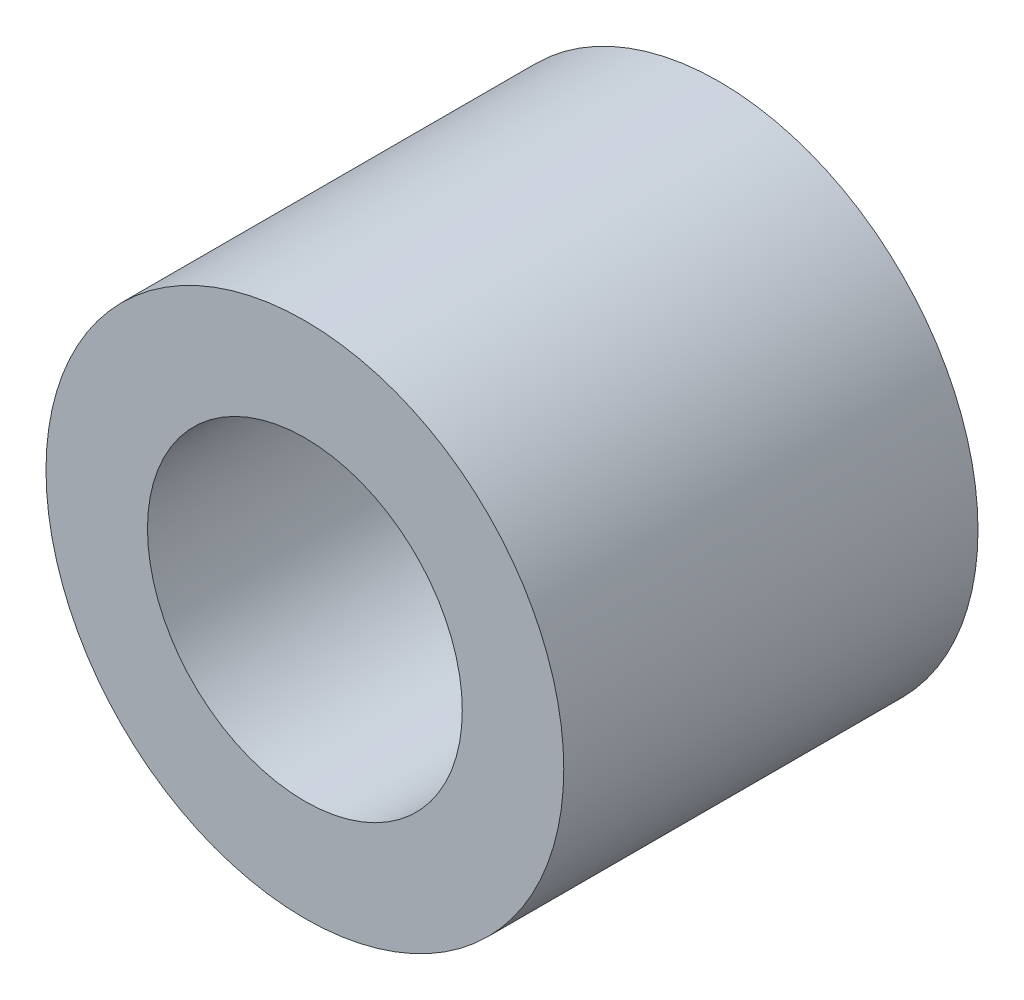
ISO-10303-21;
HEADER;
FILE_DESCRIPTION(('STEP AP214'),'2;1');
FILE_NAME('part.step','',(''),(''),'','','');
FILE_SCHEMA(('AUTOMOTIVE_DESIGN { 1 0 10303 214 1 1 1 1 }'));
ENDSEC;
DATA;
#1=APPLICATION_CONTEXT('core data for automotive mechanical design processes');
#2=APPLICATION_PROTOCOL_DEFINITION('international standard','automotive_design',2000,#1);
#3=PRODUCT_CONTEXT('',#1,'mechanical');
#4=PRODUCT('Part','Part','',(#3));
#5=PRODUCT_RELATED_PRODUCT_CATEGORY('part','',(#4));
#6=PRODUCT_DEFINITION_FORMATION('','',#4);
#7=PRODUCT_DEFINITION_CONTEXT('part definition',#1,'design');
#8=PRODUCT_DEFINITION('design','',#6,#7);
#9=PRODUCT_DEFINITION_SHAPE('','',#8);
#10=(LENGTH_UNIT() NAMED_UNIT(*) SI_UNIT(.MILLI.,.METRE.));
#11=(NAMED_UNIT(*) PLANE_ANGLE_UNIT() SI_UNIT($,.RADIAN.));
#12=(NAMED_UNIT(*) SI_UNIT($,.STERADIAN.) SOLID_ANGLE_UNIT());
#13=UNCERTAINTY_MEASURE_WITH_UNIT(LENGTH_MEASURE(1.E-05),#10,'distance_accuracy_value','');
#14=(GEOMETRIC_REPRESENTATION_CONTEXT(3) GLOBAL_UNCERTAINTY_ASSIGNED_CONTEXT((#13)) GLOBAL_UNIT_ASSIGNED_CONTEXT((#10,
#11,#12)) REPRESENTATION_CONTEXT('',''));
#15=CARTESIAN_POINT('',(0.,0.,0.));
#16=DIRECTION('',(0.,0.,1.));
#17=DIRECTION('',(1.,0.,0.));
#18=AXIS2_PLACEMENT_3D('',#15,#16,#17);
#19=CARTESIAN_POINT('',(0.,0.,-152.4));
#20=DIRECTION('',(0.,0.,1.));
#21=DIRECTION('',(1.,0.,0.));
#22=AXIS2_PLACEMENT_3D('',#19,#20,#21);
#23=CYLINDRICAL_SURFACE('',#22,7.9375);
#24=CARTESIAN_POINT('',(0.,0.,-152.4));
#25=DIRECTION('',(0.,0.,1.));
#26=DIRECTION('',(1.,0.,0.));
#27=AXIS2_PLACEMENT_3D('',#24,#25,#26);
#28=CIRCLE('',#27,7.9375);
#29=CARTESIAN_POINT('',(7.9375,0.,-152.4));
#30=VERTEX_POINT('',#29);
#31=EDGE_CURVE('E10',#30,#30,#28,.T.);
#32=CARTESIAN_POINT('',(0.,0.,-139.7));
#33=DIRECTION('',(0.,0.,1.));
#34=DIRECTION('',(1.,0.,0.));
#35=AXIS2_PLACEMENT_3D('',#32,#33,#34);
#36=CIRCLE('',#35,7.9375);
#37=CARTESIAN_POINT('',(7.9375,0.,-139.7));
#38=VERTEX_POINT('',#37);
#39=EDGE_CURVE('E45',#38,#38,#36,.T.);
#40=CARTESIAN_POINT('',(7.9375,0.,-152.4));
#41=CARTESIAN_POINT('',(7.9375,0.,-152.267708333333));
#42=CARTESIAN_POINT('',(7.9375,0.,-152.135416666667));
#43=CARTESIAN_POINT('',(7.9375,0.,-151.870833333333));
#44=CARTESIAN_POINT('',(7.9375,0.,-151.738541666667));
#45=CARTESIAN_POINT('',(7.9375,0.,-151.473958333333));
#46=CARTESIAN_POINT('',(7.9375,0.,-151.341666666667));
#47=CARTESIAN_POINT('',(7.9375,0.,-151.077083333333));
#48=CARTESIAN_POINT('',(7.9375,0.,-150.944791666667));
#49=CARTESIAN_POINT('',(7.9375,0.,-150.680208333333));
#50=CARTESIAN_POINT('',(7.9375,0.,-150.547916666667));
#51=CARTESIAN_POINT('',(7.9375,0.,-150.283333333333));
#52=CARTESIAN_POINT('',(7.9375,0.,-150.151041666667));
#53=CARTESIAN_POINT('',(7.9375,0.,-149.886458333333));
#54=CARTESIAN_POINT('',(7.9375,0.,-149.754166666667));
#55=CARTESIAN_POINT('',(7.9375,0.,-149.489583333333));
#56=CARTESIAN_POINT('',(7.9375,0.,-149.357291666667));
#57=CARTESIAN_POINT('',(7.9375,0.,-149.092708333333));
#58=CARTESIAN_POINT('',(7.9375,0.,-148.960416666667));
#59=CARTESIAN_POINT('',(7.9375,0.,-148.695833333333));
#60=CARTESIAN_POINT('',(7.9375,0.,-148.563541666667));
#61=CARTESIAN_POINT('',(7.9375,0.,-148.298958333333));
#62=CARTESIAN_POINT('',(7.9375,0.,-148.166666666667));
#63=CARTESIAN_POINT('',(7.9375,0.,-147.902083333333));
#64=CARTESIAN_POINT('',(7.9375,0.,-147.769791666667));
#65=CARTESIAN_POINT('',(7.9375,0.,-147.505208333333));
#66=CARTESIAN_POINT('',(7.9375,0.,-147.372916666667));
#67=CARTESIAN_POINT('',(7.9375,0.,-147.108333333333));
#68=CARTESIAN_POINT('',(7.9375,0.,-146.976041666667));
#69=CARTESIAN_POINT('',(7.9375,0.,-146.711458333333));
#70=CARTESIAN_POINT('',(7.9375,0.,-146.579166666667));
#71=CARTESIAN_POINT('',(7.9375,0.,-146.314583333333));
#72=CARTESIAN_POINT('',(7.9375,0.,-146.182291666667));
#73=CARTESIAN_POINT('',(7.9375,0.,-145.917708333333));
#74=CARTESIAN_POINT('',(7.9375,0.,-145.785416666667));
#75=CARTESIAN_POINT('',(7.9375,0.,-145.520833333333));
#76=CARTESIAN_POINT('',(7.9375,0.,-145.388541666667));
#77=CARTESIAN_POINT('',(7.9375,0.,-145.123958333333));
#78=CARTESIAN_POINT('',(7.9375,0.,-144.991666666667));
#79=CARTESIAN_POINT('',(7.9375,0.,-144.727083333333));
#80=CARTESIAN_POINT('',(7.9375,0.,-144.594791666667));
#81=CARTESIAN_POINT('',(7.9375,0.,-144.330208333333));
#82=CARTESIAN_POINT('',(7.9375,0.,-144.197916666667));
#83=CARTESIAN_POINT('',(7.9375,0.,-143.933333333333));
#84=CARTESIAN_POINT('',(7.9375,0.,-143.801041666667));
#85=CARTESIAN_POINT('',(7.9375,0.,-143.536458333333));
#86=CARTESIAN_POINT('',(7.9375,0.,-143.404166666667));
#87=CARTESIAN_POINT('',(7.9375,0.,-143.139583333333));
#88=CARTESIAN_POINT('',(7.9375,0.,-143.007291666667));
#89=CARTESIAN_POINT('',(7.9375,0.,-142.742708333333));
#90=CARTESIAN_POINT('',(7.9375,0.,-142.610416666667));
#91=CARTESIAN_POINT('',(7.9375,0.,-142.345833333333));
#92=CARTESIAN_POINT('',(7.9375,0.,-142.213541666667));
#93=CARTESIAN_POINT('',(7.9375,0.,-141.948958333333));
#94=CARTESIAN_POINT('',(7.9375,0.,-141.816666666667));
#95=CARTESIAN_POINT('',(7.9375,0.,-141.552083333333));
#96=CARTESIAN_POINT('',(7.9375,0.,-141.419791666667));
#97=CARTESIAN_POINT('',(7.9375,0.,-141.155208333333));
#98=CARTESIAN_POINT('',(7.9375,0.,-141.022916666667));
#99=CARTESIAN_POINT('',(7.9375,0.,-140.758333333333));
#100=CARTESIAN_POINT('',(7.9375,0.,-140.626041666667));
#101=CARTESIAN_POINT('',(7.9375,0.,-140.361458333333));
#102=CARTESIAN_POINT('',(7.9375,0.,-140.229166666667));
#103=CARTESIAN_POINT('',(7.9375,0.,-139.964583333333));
#104=CARTESIAN_POINT('',(7.9375,0.,-139.832291666667));
#105=CARTESIAN_POINT('',(7.9375,0.,-139.7));
#106=B_SPLINE_CURVE_WITH_KNOTS('',3,(#40,#41,#42,#43,#44,#45,#46,#47,#48,#49,#50,#51,#52,#53,
#54,#55,#56,#57,#58,#59,#60,#61,#62,#63,#64,#65,#66,#67,#68,#69,#70,#71,#72,#73,#74,#75,#76,#77,
#78,#79,#80,#81,#82,#83,#84,#85,#86,#87,#88,#89,#90,#91,#92,#93,#94,#95,#96,#97,#98,#99,#100,
#101,#102,#103,#104,#105),.UNSPECIFIED.,.F.,.F.,(4,2,2,2,2,2,2,2,2,2,2,2,2,2,2,2,2,2,2,2,2,2,2,
2,2,2,2,2,2,2,2,2,4),(0.,0.396875000000019,0.79375000000001,1.19062500000003,1.58750000000002,
1.98437500000001,2.38125000000003,2.77812500000002,3.17500000000004,3.57187500000003,
3.96875000000002,4.36562500000004,4.76250000000003,5.15937500000002,5.55625000000004,
5.95312500000003,6.35000000000005,6.74687500000004,7.14375000000003,7.54062500000005,
7.93750000000004,8.33437500000003,8.73125000000005,9.12812500000004,9.52500000000006,
9.92187500000005,10.31875,10.7156250000001,11.1125000000001,11.509375,11.9062500000001,
12.3031250000001,12.7000000000001),.UNSPECIFIED.);
#107=EDGE_CURVE('BSEAM32',#30,#38,#106,.T.);
#108=ORIENTED_EDGE('',*,*,#31,.T.);
#109=ORIENTED_EDGE('',*,*,#39,.F.);
#110=ORIENTED_EDGE('',*,*,#107,.T.);
#111=ORIENTED_EDGE('',*,*,#107,.F.);
#112=EDGE_LOOP('',(#108,#110,#109,#111));
#113=FACE_BOUND('',#112,.T.);
#114=ADVANCED_FACE('F32',(#113),#23,.T.);
#115=CARTESIAN_POINT('',(0.,0.,-152.4));
#116=DIRECTION('',(0.,0.,1.));
#117=DIRECTION('',(1.,0.,0.));
#118=AXIS2_PLACEMENT_3D('',#115,#116,#117);
#119=CYLINDRICAL_SURFACE('',#118,4.826);
#120=CARTESIAN_POINT('',(0.,0.,-152.4));
#121=DIRECTION('',(0.,0.,1.));
#122=DIRECTION('',(1.,0.,0.));
#123=AXIS2_PLACEMENT_3D('',#120,#121,#122);
#124=CIRCLE('',#123,4.826);
#125=CARTESIAN_POINT('',(4.826,0.,-152.4));
#126=VERTEX_POINT('',#125);
#127=EDGE_CURVE('E39',#126,#126,#124,.T.);
#128=CARTESIAN_POINT('',(0.,0.,-139.7));
#129=DIRECTION('',(0.,0.,1.));
#130=DIRECTION('',(1.,0.,0.));
#131=AXIS2_PLACEMENT_3D('',#128,#129,#130);
#132=CIRCLE('',#131,4.826);
#133=CARTESIAN_POINT('',(4.826,0.,-139.7));
#134=VERTEX_POINT('',#133);
#135=EDGE_CURVE('E35',#134,#134,#132,.F.);
#136=CARTESIAN_POINT('',(4.826,0.,-152.4));
#137=CARTESIAN_POINT('',(4.826,0.,-152.267708333333));
#138=CARTESIAN_POINT('',(4.826,0.,-152.135416666667));
#139=CARTESIAN_POINT('',(4.826,0.,-151.870833333333));
#140=CARTESIAN_POINT('',(4.826,0.,-151.738541666667));
#141=CARTESIAN_POINT('',(4.826,0.,-151.473958333333));
#142=CARTESIAN_POINT('',(4.826,0.,-151.341666666667));
#143=CARTESIAN_POINT('',(4.826,0.,-151.077083333333));
#144=CARTESIAN_POINT('',(4.826,0.,-150.944791666667));
#145=CARTESIAN_POINT('',(4.826,0.,-150.680208333333));
#146=CARTESIAN_POINT('',(4.826,0.,-150.547916666667));
#147=CARTESIAN_POINT('',(4.826,0.,-150.283333333333));
#148=CARTESIAN_POINT('',(4.826,0.,-150.151041666667));
#149=CARTESIAN_POINT('',(4.826,0.,-149.886458333333));
#150=CARTESIAN_POINT('',(4.826,0.,-149.754166666667));
#151=CARTESIAN_POINT('',(4.826,0.,-149.489583333333));
#152=CARTESIAN_POINT('',(4.826,0.,-149.357291666667));
#153=CARTESIAN_POINT('',(4.826,0.,-149.092708333333));
#154=CARTESIAN_POINT('',(4.826,0.,-148.960416666667));
#155=CARTESIAN_POINT('',(4.826,0.,-148.695833333333));
#156=CARTESIAN_POINT('',(4.826,0.,-148.563541666667));
#157=CARTESIAN_POINT('',(4.826,0.,-148.298958333333));
#158=CARTESIAN_POINT('',(4.826,0.,-148.166666666667));
#159=CARTESIAN_POINT('',(4.826,0.,-147.902083333333));
#160=CARTESIAN_POINT('',(4.826,0.,-147.769791666667));
#161=CARTESIAN_POINT('',(4.826,0.,-147.505208333333));
#162=CARTESIAN_POINT('',(4.826,0.,-147.372916666667));
#163=CARTESIAN_POINT('',(4.826,0.,-147.108333333333));
#164=CARTESIAN_POINT('',(4.826,0.,-146.976041666667));
#165=CARTESIAN_POINT('',(4.826,0.,-146.711458333333));
#166=CARTESIAN_POINT('',(4.826,0.,-146.579166666667));
#167=CARTESIAN_POINT('',(4.826,0.,-146.314583333333));
#168=CARTESIAN_POINT('',(4.826,0.,-146.182291666667));
#169=CARTESIAN_POINT('',(4.826,0.,-145.917708333333));
#170=CARTESIAN_POINT('',(4.826,0.,-145.785416666667));
#171=CARTESIAN_POINT('',(4.826,0.,-145.520833333333));
#172=CARTESIAN_POINT('',(4.826,0.,-145.388541666667));
#173=CARTESIAN_POINT('',(4.826,0.,-145.123958333333));
#174=CARTESIAN_POINT('',(4.826,0.,-144.991666666667));
#175=CARTESIAN_POINT('',(4.826,0.,-144.727083333333));
#176=CARTESIAN_POINT('',(4.826,0.,-144.594791666667));
#177=CARTESIAN_POINT('',(4.826,0.,-144.330208333333));
#178=CARTESIAN_POINT('',(4.826,0.,-144.197916666667));
#179=CARTESIAN_POINT('',(4.826,0.,-143.933333333333));
#180=CARTESIAN_POINT('',(4.826,0.,-143.801041666667));
#181=CARTESIAN_POINT('',(4.826,0.,-143.536458333333));
#182=CARTESIAN_POINT('',(4.826,0.,-143.404166666667));
#183=CARTESIAN_POINT('',(4.826,0.,-143.139583333333));
#184=CARTESIAN_POINT('',(4.826,0.,-143.007291666667));
#185=CARTESIAN_POINT('',(4.826,0.,-142.742708333333));
#186=CARTESIAN_POINT('',(4.826,0.,-142.610416666667));
#187=CARTESIAN_POINT('',(4.826,0.,-142.345833333333));
#188=CARTESIAN_POINT('',(4.826,0.,-142.213541666667));
#189=CARTESIAN_POINT('',(4.826,0.,-141.948958333333));
#190=CARTESIAN_POINT('',(4.826,0.,-141.816666666667));
#191=CARTESIAN_POINT('',(4.826,0.,-141.552083333333));
#192=CARTESIAN_POINT('',(4.826,0.,-141.419791666667));
#193=CARTESIAN_POINT('',(4.826,0.,-141.155208333333));
#194=CARTESIAN_POINT('',(4.826,0.,-141.022916666667));
#195=CARTESIAN_POINT('',(4.826,0.,-140.758333333333));
#196=CARTESIAN_POINT('',(4.826,0.,-140.626041666667));
#197=CARTESIAN_POINT('',(4.826,0.,-140.361458333333));
#198=CARTESIAN_POINT('',(4.826,0.,-140.229166666667));
#199=CARTESIAN_POINT('',(4.826,0.,-139.964583333333));
#200=CARTESIAN_POINT('',(4.826,0.,-139.832291666667));
#201=CARTESIAN_POINT('',(4.826,0.,-139.7));
#202=B_SPLINE_CURVE_WITH_KNOTS('',3,(#136,#137,#138,#139,#140,#141,#142,#143,#144,#145,#146,
#147,#148,#149,#150,#151,#152,#153,#154,#155,#156,#157,#158,#159,#160,#161,#162,#163,#164,#165,
#166,#167,#168,#169,#170,#171,#172,#173,#174,#175,#176,#177,#178,#179,#180,#181,#182,#183,#184,
#185,#186,#187,#188,#189,#190,#191,#192,#193,#194,#195,#196,#197,#198,#199,#200,#201),
.UNSPECIFIED.,.F.,.F.,(4,2,2,2,2,2,2,2,2,2,2,2,2,2,2,2,2,2,2,2,2,2,2,2,2,2,2,2,2,2,2,2,4),(0.,
0.396875000000019,0.79375000000001,1.19062500000003,1.58750000000002,1.98437500000001,
2.38125000000003,2.77812500000002,3.17500000000004,3.57187500000003,3.96875000000002,
4.36562500000004,4.76250000000003,5.15937500000002,5.55625000000004,5.95312500000003,
6.35000000000005,6.74687500000004,7.14375000000003,7.54062500000005,7.93750000000004,
8.33437500000003,8.73125000000005,9.12812500000004,9.52500000000006,9.92187500000005,10.31875,
10.7156250000001,11.1125000000001,11.509375,11.9062500000001,12.3031250000001,12.7000000000001),.UNSPECIFIED.);
#203=EDGE_CURVE('BSEAM54',#126,#134,#202,.T.);
#204=ORIENTED_EDGE('',*,*,#127,.F.);
#205=ORIENTED_EDGE('',*,*,#135,.F.);
#206=ORIENTED_EDGE('',*,*,#203,.T.);
#207=ORIENTED_EDGE('',*,*,#203,.F.);
#208=EDGE_LOOP('',(#204,#206,#205,#207));
#209=FACE_BOUND('',#208,.T.);
#210=ADVANCED_FACE('F54',(#209),#119,.F.);
#211=CARTESIAN_POINT('',(0.,0.,-152.4));
#212=DIRECTION('',(0.,0.,1.));
#213=DIRECTION('',(1.,0.,0.));
#214=AXIS2_PLACEMENT_3D('',#211,#212,#213);
#215=PLANE('',#214);
#216=ORIENTED_EDGE('',*,*,#127,.T.);
#217=EDGE_LOOP('',(#216));
#218=FACE_BOUND('',#217,.T.);
#219=ORIENTED_EDGE('',*,*,#31,.F.);
#220=EDGE_LOOP('',(#219));
#221=FACE_BOUND('',#220,.T.);
#222=ADVANCED_FACE('F56',(#218,#221),#215,.F.);
#223=CARTESIAN_POINT('',(0.,0.,-139.7));
#224=DIRECTION('',(0.,0.,1.));
#225=DIRECTION('',(1.,0.,0.));
#226=AXIS2_PLACEMENT_3D('',#223,#224,#225);
#227=PLANE('',#226);
#228=ORIENTED_EDGE('',*,*,#39,.T.);
#229=EDGE_LOOP('',(#228));
#230=FACE_BOUND('',#229,.T.);
#231=ORIENTED_EDGE('',*,*,#135,.T.);
#232=EDGE_LOOP('',(#231));
#233=FACE_BOUND('',#232,.T.);
#234=ADVANCED_FACE('F52',(#230,#233),#227,.T.);
#235=CLOSED_SHELL('',(#114,#210,#222,#234));
#236=MANIFOLD_SOLID_BREP('B2',#235);
#237=ADVANCED_BREP_SHAPE_REPRESENTATION('',(#18,#236),#14);
#238=SHAPE_DEFINITION_REPRESENTATION(#9,#237);
ENDSEC;
END-ISO-10303-21;
